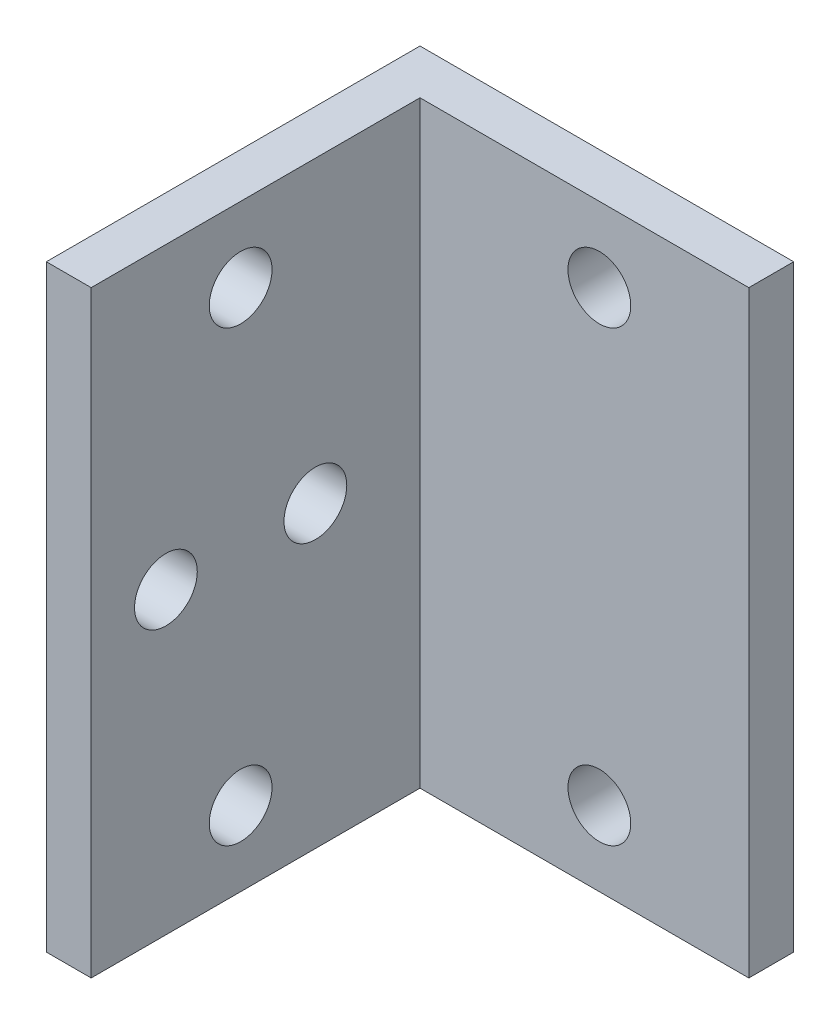
ISO-10303-21;
HEADER;
FILE_DESCRIPTION(('STEP AP214'),'2;1');
FILE_NAME('part.step','',(''),(''),'','','');
FILE_SCHEMA(('AUTOMOTIVE_DESIGN { 1 0 10303 214 1 1 1 1 }'));
ENDSEC;
DATA;
#1=APPLICATION_CONTEXT('core data for automotive mechanical design processes');
#2=APPLICATION_PROTOCOL_DEFINITION('international standard','automotive_design',2000,#1);
#3=PRODUCT_CONTEXT('',#1,'mechanical');
#4=PRODUCT('Part','Part','',(#3));
#5=PRODUCT_RELATED_PRODUCT_CATEGORY('part','',(#4));
#6=PRODUCT_DEFINITION_FORMATION('','',#4);
#7=PRODUCT_DEFINITION_CONTEXT('part definition',#1,'design');
#8=PRODUCT_DEFINITION('design','',#6,#7);
#9=PRODUCT_DEFINITION_SHAPE('','',#8);
#10=(LENGTH_UNIT() NAMED_UNIT(*) SI_UNIT(.MILLI.,.METRE.));
#11=(NAMED_UNIT(*) PLANE_ANGLE_UNIT() SI_UNIT($,.RADIAN.));
#12=(NAMED_UNIT(*) SI_UNIT($,.STERADIAN.) SOLID_ANGLE_UNIT());
#13=UNCERTAINTY_MEASURE_WITH_UNIT(LENGTH_MEASURE(1.E-05),#10,'distance_accuracy_value','');
#14=(GEOMETRIC_REPRESENTATION_CONTEXT(3) GLOBAL_UNCERTAINTY_ASSIGNED_CONTEXT((#13)) GLOBAL_UNIT_ASSIGNED_CONTEXT((#10,
#11,#12)) REPRESENTATION_CONTEXT('',''));
#15=CARTESIAN_POINT('',(0.,0.,0.));
#16=DIRECTION('',(0.,0.,1.));
#17=DIRECTION('',(1.,0.,0.));
#18=AXIS2_PLACEMENT_3D('',#15,#16,#17);
#19=CARTESIAN_POINT('',(58.,220.,-4.99999999999998));
#20=DIRECTION('',(0.,1.,0.));
#21=DIRECTION('',(0.,0.,1.));
#22=AXIS2_PLACEMENT_3D('',#19,#20,#21);
#23=PLANE('',#22);
#24=DIRECTION('',(-1.,0.,0.));
#25=VECTOR('',#24,1.);
#26=CARTESIAN_POINT('',(58.,220.,-1.99999999999999));
#27=LINE('',#26,#25);
#28=CARTESIAN_POINT('',(58.,220.,-1.99999999999999));
#29=VERTEX_POINT('',#28);
#30=CARTESIAN_POINT('',(36.,220.,-1.99999999999999));
#31=VERTEX_POINT('',#30);
#32=EDGE_CURVE('E99',#29,#31,#27,.T.);
#33=ORIENTED_EDGE('',*,*,#32,.F.);
#34=DIRECTION('',(0.,0.,1.));
#35=VECTOR('',#34,1.);
#36=CARTESIAN_POINT('',(58.,220.,-4.99999999999998));
#37=LINE('',#36,#35);
#38=CARTESIAN_POINT('',(58.,220.,-4.99999999999998));
#39=VERTEX_POINT('',#38);
#40=EDGE_CURVE('E11',#39,#29,#37,.T.);
#41=ORIENTED_EDGE('',*,*,#40,.F.);
#42=DIRECTION('',(-1.,0.,0.));
#43=VECTOR('',#42,1.);
#44=CARTESIAN_POINT('',(58.,220.,-4.99999999999998));
#45=LINE('',#44,#43);
#46=CARTESIAN_POINT('',(33.,220.,-4.99999999999998));
#47=VERTEX_POINT('',#46);
#48=EDGE_CURVE('E122',#39,#47,#45,.T.);
#49=ORIENTED_EDGE('',*,*,#48,.T.);
#50=DIRECTION('',(0.,0.,1.));
#51=VECTOR('',#50,1.);
#52=CARTESIAN_POINT('',(33.,220.,-4.99999999999998));
#53=LINE('',#52,#51);
#54=CARTESIAN_POINT('',(33.,220.,20.));
#55=VERTEX_POINT('',#54);
#56=EDGE_CURVE('E77',#47,#55,#53,.T.);
#57=ORIENTED_EDGE('',*,*,#56,.T.);
#58=DIRECTION('',(-1.,0.,0.));
#59=VECTOR('',#58,1.);
#60=CARTESIAN_POINT('',(58.,220.,20.));
#61=LINE('',#60,#59);
#62=CARTESIAN_POINT('',(36.,220.,20.));
#63=VERTEX_POINT('',#62);
#64=EDGE_CURVE('E120',#63,#55,#61,.T.);
#65=ORIENTED_EDGE('',*,*,#64,.F.);
#66=DIRECTION('',(0.,0.,1.));
#67=VECTOR('',#66,1.);
#68=CARTESIAN_POINT('',(36.,220.,-1.99999999999999));
#69=LINE('',#68,#67);
#70=EDGE_CURVE('E48',#31,#63,#69,.T.);
#71=ORIENTED_EDGE('',*,*,#70,.F.);
#72=EDGE_LOOP('',(#33,#41,#49,#57,#65,#71));
#73=FACE_BOUND('',#72,.T.);
#74=ADVANCED_FACE('F32',(#73),#23,.T.);
#75=CARTESIAN_POINT('',(58.,180.,-4.99999999999998));
#76=DIRECTION('',(1.,0.,0.));
#77=DIRECTION('',(0.,0.,-1.));
#78=AXIS2_PLACEMENT_3D('',#75,#76,#77);
#79=PLANE('',#78);
#80=DIRECTION('',(0.,1.,0.));
#81=VECTOR('',#80,1.);
#82=CARTESIAN_POINT('',(58.,180.,-1.99999999999999));
#83=LINE('',#82,#81);
#84=CARTESIAN_POINT('',(58.,180.,-1.99999999999999));
#85=VERTEX_POINT('',#84);
#86=EDGE_CURVE('E118',#85,#29,#83,.T.);
#87=ORIENTED_EDGE('',*,*,#86,.F.);
#88=DIRECTION('',(0.,0.,1.));
#89=VECTOR('',#88,1.);
#90=CARTESIAN_POINT('',(58.,180.,-4.99999999999998));
#91=LINE('',#90,#89);
#92=CARTESIAN_POINT('',(58.,180.,-4.99999999999998));
#93=VERTEX_POINT('',#92);
#94=EDGE_CURVE('E40',#93,#85,#91,.T.);
#95=ORIENTED_EDGE('',*,*,#94,.F.);
#96=DIRECTION('',(0.,1.,0.));
#97=VECTOR('',#96,1.);
#98=CARTESIAN_POINT('',(58.,180.,-4.99999999999998));
#99=LINE('',#98,#97);
#100=EDGE_CURVE('E129',#93,#39,#99,.T.);
#101=ORIENTED_EDGE('',*,*,#100,.T.);
#102=ORIENTED_EDGE('',*,*,#40,.T.);
#103=EDGE_LOOP('',(#87,#95,#101,#102));
#104=FACE_BOUND('',#103,.T.);
#105=ADVANCED_FACE('F147',(#104),#79,.T.);
#106=CARTESIAN_POINT('',(33.,180.,-4.99999999999998));
#107=DIRECTION('',(0.,-1.,0.));
#108=DIRECTION('',(0.,0.,-1.));
#109=AXIS2_PLACEMENT_3D('',#106,#107,#108);
#110=PLANE('',#109);
#111=DIRECTION('',(-1.,0.,0.));
#112=VECTOR('',#111,1.);
#113=CARTESIAN_POINT('',(58.,180.,-1.99999999999999));
#114=LINE('',#113,#112);
#115=CARTESIAN_POINT('',(36.,180.,-1.99999999999999));
#116=VERTEX_POINT('',#115);
#117=EDGE_CURVE('E97',#85,#116,#114,.T.);
#118=ORIENTED_EDGE('',*,*,#117,.T.);
#119=DIRECTION('',(0.,0.,1.));
#120=VECTOR('',#119,1.);
#121=CARTESIAN_POINT('',(36.,180.,-1.99999999999999));
#122=LINE('',#121,#120);
#123=CARTESIAN_POINT('',(36.,180.,20.));
#124=VERTEX_POINT('',#123);
#125=EDGE_CURVE('E101',#116,#124,#122,.T.);
#126=ORIENTED_EDGE('',*,*,#125,.T.);
#127=DIRECTION('',(1.,0.,0.));
#128=VECTOR('',#127,1.);
#129=CARTESIAN_POINT('',(33.,180.,20.));
#130=LINE('',#129,#128);
#131=CARTESIAN_POINT('',(33.,180.,20.));
#132=VERTEX_POINT('',#131);
#133=EDGE_CURVE('E125',#132,#124,#130,.T.);
#134=ORIENTED_EDGE('',*,*,#133,.F.);
#135=DIRECTION('',(0.,0.,1.));
#136=VECTOR('',#135,1.);
#137=CARTESIAN_POINT('',(33.,180.,-4.99999999999998));
#138=LINE('',#137,#136);
#139=CARTESIAN_POINT('',(33.,180.,-4.99999999999998));
#140=VERTEX_POINT('',#139);
#141=EDGE_CURVE('E72',#140,#132,#138,.T.);
#142=ORIENTED_EDGE('',*,*,#141,.F.);
#143=DIRECTION('',(1.,0.,0.));
#144=VECTOR('',#143,1.);
#145=CARTESIAN_POINT('',(33.,180.,-4.99999999999998));
#146=LINE('',#145,#144);
#147=EDGE_CURVE('E127',#140,#93,#146,.T.);
#148=ORIENTED_EDGE('',*,*,#147,.T.);
#149=ORIENTED_EDGE('',*,*,#94,.T.);
#150=EDGE_LOOP('',(#118,#126,#134,#142,#148,#149));
#151=FACE_BOUND('',#150,.T.);
#152=ADVANCED_FACE('F109',(#151),#110,.T.);
#153=CARTESIAN_POINT('',(33.,220.,-4.99999999999998));
#154=DIRECTION('',(-1.,0.,0.));
#155=DIRECTION('',(0.,0.,1.));
#156=AXIS2_PLACEMENT_3D('',#153,#154,#155);
#157=PLANE('',#156);
#158=CARTESIAN_POINT('',(33.,185.,10.));
#159=DIRECTION('',(1.,0.,0.));
#160=DIRECTION('',(0.,0.,-1.));
#161=AXIS2_PLACEMENT_3D('',#158,#159,#160);
#162=CIRCLE('',#161,2.09999999999999);
#163=CARTESIAN_POINT('',(33.,185.,7.90000000000001));
#164=VERTEX_POINT('',#163);
#165=EDGE_CURVE('E166',#164,#164,#162,.T.);
#166=ORIENTED_EDGE('',*,*,#165,.T.);
#167=EDGE_LOOP('',(#166));
#168=FACE_BOUND('',#167,.T.);
#169=CARTESIAN_POINT('',(33.,215.,10.));
#170=DIRECTION('',(1.,0.,0.));
#171=DIRECTION('',(0.,0.,-1.));
#172=AXIS2_PLACEMENT_3D('',#169,#170,#171);
#173=CIRCLE('',#172,2.09999999999999);
#174=CARTESIAN_POINT('',(33.,215.,7.90000000000001));
#175=VERTEX_POINT('',#174);
#176=EDGE_CURVE('E170',#175,#175,#173,.T.);
#177=ORIENTED_EDGE('',*,*,#176,.T.);
#178=EDGE_LOOP('',(#177));
#179=FACE_BOUND('',#178,.T.);
#180=CARTESIAN_POINT('',(33.,200.,5.00000000000001));
#181=DIRECTION('',(1.,0.,0.));
#182=DIRECTION('',(0.,0.,-1.));
#183=AXIS2_PLACEMENT_3D('',#180,#181,#182);
#184=CIRCLE('',#183,2.09999999999999);
#185=CARTESIAN_POINT('',(33.,200.,2.90000000000002));
#186=VERTEX_POINT('',#185);
#187=EDGE_CURVE('E174',#186,#186,#184,.T.);
#188=ORIENTED_EDGE('',*,*,#187,.T.);
#189=EDGE_LOOP('',(#188));
#190=FACE_BOUND('',#189,.T.);
#191=CARTESIAN_POINT('',(33.,200.,15.));
#192=DIRECTION('',(1.,0.,0.));
#193=DIRECTION('',(0.,0.,-1.));
#194=AXIS2_PLACEMENT_3D('',#191,#192,#193);
#195=CIRCLE('',#194,2.09999999999999);
#196=CARTESIAN_POINT('',(33.,200.,12.9));
#197=VERTEX_POINT('',#196);
#198=EDGE_CURVE('E177',#197,#197,#195,.T.);
#199=ORIENTED_EDGE('',*,*,#198,.T.);
#200=EDGE_LOOP('',(#199));
#201=FACE_BOUND('',#200,.T.);
#202=DIRECTION('',(0.,-1.,0.));
#203=VECTOR('',#202,1.);
#204=CARTESIAN_POINT('',(33.,220.,20.));
#205=LINE('',#204,#203);
#206=EDGE_CURVE('E133',#55,#132,#205,.T.);
#207=ORIENTED_EDGE('',*,*,#206,.F.);
#208=ORIENTED_EDGE('',*,*,#56,.F.);
#209=DIRECTION('',(0.,-1.,0.));
#210=VECTOR('',#209,1.);
#211=CARTESIAN_POINT('',(33.,220.,-4.99999999999998));
#212=LINE('',#211,#210);
#213=EDGE_CURVE('E124',#47,#140,#212,.T.);
#214=ORIENTED_EDGE('',*,*,#213,.T.);
#215=ORIENTED_EDGE('',*,*,#141,.T.);
#216=EDGE_LOOP('',(#207,#208,#214,#215));
#217=FACE_BOUND('',#216,.T.);
#218=ADVANCED_FACE('F139',(#168,#179,#190,#201,#217),#157,.T.);
#219=CARTESIAN_POINT('',(0.,0.,-4.99999999999998));
#220=DIRECTION('',(0.,0.,1.));
#221=DIRECTION('',(1.,0.,0.));
#222=AXIS2_PLACEMENT_3D('',#219,#220,#221);
#223=PLANE('',#222);
#224=CARTESIAN_POINT('',(48.,185.,-4.99999999999998));
#225=DIRECTION('',(0.,0.,-1.));
#226=DIRECTION('',(-1.,0.,0.));
#227=AXIS2_PLACEMENT_3D('',#224,#225,#226);
#228=CIRCLE('',#227,2.09999999999998);
#229=CARTESIAN_POINT('',(45.9,185.,-4.99999999999998));
#230=VERTEX_POINT('',#229);
#231=EDGE_CURVE('E179',#230,#230,#228,.T.);
#232=ORIENTED_EDGE('',*,*,#231,.F.);
#233=EDGE_LOOP('',(#232));
#234=FACE_BOUND('',#233,.T.);
#235=CARTESIAN_POINT('',(48.,215.,-4.99999999999998));
#236=DIRECTION('',(0.,0.,-1.));
#237=DIRECTION('',(-1.,0.,0.));
#238=AXIS2_PLACEMENT_3D('',#235,#236,#237);
#239=CIRCLE('',#238,2.09999999999998);
#240=CARTESIAN_POINT('',(45.9,215.,-4.99999999999998));
#241=VERTEX_POINT('',#240);
#242=EDGE_CURVE('E187',#241,#241,#239,.T.);
#243=ORIENTED_EDGE('',*,*,#242,.F.);
#244=EDGE_LOOP('',(#243));
#245=FACE_BOUND('',#244,.T.);
#246=ORIENTED_EDGE('',*,*,#48,.F.);
#247=ORIENTED_EDGE('',*,*,#100,.F.);
#248=ORIENTED_EDGE('',*,*,#147,.F.);
#249=ORIENTED_EDGE('',*,*,#213,.F.);
#250=EDGE_LOOP('',(#246,#247,#248,#249));
#251=FACE_BOUND('',#250,.T.);
#252=ADVANCED_FACE('F145',(#234,#245,#251),#223,.F.);
#253=CARTESIAN_POINT('',(0.,0.,20.));
#254=DIRECTION('',(0.,0.,1.));
#255=DIRECTION('',(1.,0.,0.));
#256=AXIS2_PLACEMENT_3D('',#253,#254,#255);
#257=PLANE('',#256);
#258=DIRECTION('',(0.,1.,0.));
#259=VECTOR('',#258,1.);
#260=CARTESIAN_POINT('',(36.,180.,20.));
#261=LINE('',#260,#259);
#262=EDGE_CURVE('E100',#124,#63,#261,.T.);
#263=ORIENTED_EDGE('',*,*,#262,.T.);
#264=ORIENTED_EDGE('',*,*,#64,.T.);
#265=ORIENTED_EDGE('',*,*,#206,.T.);
#266=ORIENTED_EDGE('',*,*,#133,.T.);
#267=EDGE_LOOP('',(#263,#264,#265,#266));
#268=FACE_BOUND('',#267,.T.);
#269=ADVANCED_FACE('F141',(#268),#257,.T.);
#270=CARTESIAN_POINT('',(58.,180.,-1.99999999999999));
#271=DIRECTION('',(0.,0.,-1.));
#272=DIRECTION('',(-1.,0.,0.));
#273=AXIS2_PLACEMENT_3D('',#270,#271,#272);
#274=PLANE('',#273);
#275=CARTESIAN_POINT('',(48.,185.,-1.99999999999999));
#276=DIRECTION('',(0.,0.,-1.));
#277=DIRECTION('',(-1.,0.,0.));
#278=AXIS2_PLACEMENT_3D('',#275,#276,#277);
#279=CIRCLE('',#278,2.09999999999998);
#280=CARTESIAN_POINT('',(45.9,185.,-1.99999999999999));
#281=VERTEX_POINT('',#280);
#282=EDGE_CURVE('E35',#281,#281,#279,.T.);
#283=ORIENTED_EDGE('',*,*,#282,.T.);
#284=EDGE_LOOP('',(#283));
#285=FACE_BOUND('',#284,.T.);
#286=CARTESIAN_POINT('',(48.,215.,-1.99999999999999));
#287=DIRECTION('',(0.,0.,-1.));
#288=DIRECTION('',(-1.,0.,0.));
#289=AXIS2_PLACEMENT_3D('',#286,#287,#288);
#290=CIRCLE('',#289,2.09999999999998);
#291=CARTESIAN_POINT('',(45.9,215.,-1.99999999999999));
#292=VERTEX_POINT('',#291);
#293=EDGE_CURVE('E114',#292,#292,#290,.T.);
#294=ORIENTED_EDGE('',*,*,#293,.T.);
#295=EDGE_LOOP('',(#294));
#296=FACE_BOUND('',#295,.T.);
#297=ORIENTED_EDGE('',*,*,#32,.T.);
#298=DIRECTION('',(0.,1.,0.));
#299=VECTOR('',#298,1.);
#300=CARTESIAN_POINT('',(36.,180.,-1.99999999999999));
#301=LINE('',#300,#299);
#302=EDGE_CURVE('E93',#116,#31,#301,.T.);
#303=ORIENTED_EDGE('',*,*,#302,.F.);
#304=ORIENTED_EDGE('',*,*,#117,.F.);
#305=ORIENTED_EDGE('',*,*,#86,.T.);
#306=EDGE_LOOP('',(#297,#303,#304,#305));
#307=FACE_BOUND('',#306,.T.);
#308=ADVANCED_FACE('F95',(#285,#296,#307),#274,.F.);
#309=CARTESIAN_POINT('',(36.,180.,-1.99999999999999));
#310=DIRECTION('',(-1.,0.,0.));
#311=DIRECTION('',(0.,0.,1.));
#312=AXIS2_PLACEMENT_3D('',#309,#310,#311);
#313=PLANE('',#312);
#314=CARTESIAN_POINT('',(36.,185.,10.));
#315=DIRECTION('',(1.,0.,0.));
#316=DIRECTION('',(0.,0.,-1.));
#317=AXIS2_PLACEMENT_3D('',#314,#315,#316);
#318=CIRCLE('',#317,2.09999999999999);
#319=CARTESIAN_POINT('',(36.,185.,7.90000000000001));
#320=VERTEX_POINT('',#319);
#321=EDGE_CURVE('E292',#320,#320,#318,.T.);
#322=ORIENTED_EDGE('',*,*,#321,.F.);
#323=EDGE_LOOP('',(#322));
#324=FACE_BOUND('',#323,.T.);
#325=CARTESIAN_POINT('',(36.,215.,10.));
#326=DIRECTION('',(1.,0.,0.));
#327=DIRECTION('',(0.,0.,-1.));
#328=AXIS2_PLACEMENT_3D('',#325,#326,#327);
#329=CIRCLE('',#328,2.09999999999999);
#330=CARTESIAN_POINT('',(36.,215.,7.90000000000001));
#331=VERTEX_POINT('',#330);
#332=EDGE_CURVE('E294',#331,#331,#329,.T.);
#333=ORIENTED_EDGE('',*,*,#332,.F.);
#334=EDGE_LOOP('',(#333));
#335=FACE_BOUND('',#334,.T.);
#336=CARTESIAN_POINT('',(36.,200.,5.00000000000001));
#337=DIRECTION('',(1.,0.,0.));
#338=DIRECTION('',(0.,0.,-1.));
#339=AXIS2_PLACEMENT_3D('',#336,#337,#338);
#340=CIRCLE('',#339,2.09999999999999);
#341=CARTESIAN_POINT('',(36.,200.,2.90000000000002));
#342=VERTEX_POINT('',#341);
#343=EDGE_CURVE('E300',#342,#342,#340,.T.);
#344=ORIENTED_EDGE('',*,*,#343,.F.);
#345=EDGE_LOOP('',(#344));
#346=FACE_BOUND('',#345,.T.);
#347=CARTESIAN_POINT('',(36.,200.,15.));
#348=DIRECTION('',(1.,0.,0.));
#349=DIRECTION('',(0.,0.,-1.));
#350=AXIS2_PLACEMENT_3D('',#347,#348,#349);
#351=CIRCLE('',#350,2.09999999999999);
#352=CARTESIAN_POINT('',(36.,200.,12.9));
#353=VERTEX_POINT('',#352);
#354=EDGE_CURVE('E180',#353,#353,#351,.T.);
#355=ORIENTED_EDGE('',*,*,#354,.F.);
#356=EDGE_LOOP('',(#355));
#357=FACE_BOUND('',#356,.T.);
#358=ORIENTED_EDGE('',*,*,#70,.T.);
#359=ORIENTED_EDGE('',*,*,#262,.F.);
#360=ORIENTED_EDGE('',*,*,#125,.F.);
#361=ORIENTED_EDGE('',*,*,#302,.T.);
#362=EDGE_LOOP('',(#358,#359,#360,#361));
#363=FACE_BOUND('',#362,.T.);
#364=ADVANCED_FACE('F104',(#324,#335,#346,#357,#363),#313,.F.);
#365=CARTESIAN_POINT('',(48.,215.,-4.99999999999998));
#366=DIRECTION('',(0.,0.,-1.));
#367=DIRECTION('',(-1.,0.,0.));
#368=AXIS2_PLACEMENT_3D('',#365,#366,#367);
#369=CYLINDRICAL_SURFACE('',#368,2.09999999999998);
#370=ORIENTED_EDGE('',*,*,#242,.T.);
#371=EDGE_LOOP('',(#370));
#372=FACE_BOUND('',#371,.T.);
#373=ORIENTED_EDGE('',*,*,#293,.F.);
#374=EDGE_LOOP('',(#373));
#375=FACE_BOUND('',#374,.T.);
#376=ADVANCED_FACE('F200',(#372,#375),#369,.F.);
#377=CARTESIAN_POINT('',(48.,185.,-4.99999999999998));
#378=DIRECTION('',(0.,0.,-1.));
#379=DIRECTION('',(-1.,0.,0.));
#380=AXIS2_PLACEMENT_3D('',#377,#378,#379);
#381=CYLINDRICAL_SURFACE('',#380,2.09999999999998);
#382=ORIENTED_EDGE('',*,*,#231,.T.);
#383=EDGE_LOOP('',(#382));
#384=FACE_BOUND('',#383,.T.);
#385=ORIENTED_EDGE('',*,*,#282,.F.);
#386=EDGE_LOOP('',(#385));
#387=FACE_BOUND('',#386,.T.);
#388=ADVANCED_FACE('F197',(#384,#387),#381,.F.);
#389=CARTESIAN_POINT('',(36.,200.,15.));
#390=DIRECTION('',(1.,0.,0.));
#391=DIRECTION('',(0.,0.,-1.));
#392=AXIS2_PLACEMENT_3D('',#389,#390,#391);
#393=CYLINDRICAL_SURFACE('',#392,2.09999999999999);
#394=ORIENTED_EDGE('',*,*,#198,.F.);
#395=EDGE_LOOP('',(#394));
#396=FACE_BOUND('',#395,.T.);
#397=ORIENTED_EDGE('',*,*,#354,.T.);
#398=EDGE_LOOP('',(#397));
#399=FACE_BOUND('',#398,.T.);
#400=ADVANCED_FACE('F199',(#396,#399),#393,.F.);
#401=CARTESIAN_POINT('',(36.,200.,5.00000000000001));
#402=DIRECTION('',(1.,0.,0.));
#403=DIRECTION('',(0.,0.,-1.));
#404=AXIS2_PLACEMENT_3D('',#401,#402,#403);
#405=CYLINDRICAL_SURFACE('',#404,2.09999999999999);
#406=ORIENTED_EDGE('',*,*,#187,.F.);
#407=EDGE_LOOP('',(#406));
#408=FACE_BOUND('',#407,.T.);
#409=ORIENTED_EDGE('',*,*,#343,.T.);
#410=EDGE_LOOP('',(#409));
#411=FACE_BOUND('',#410,.T.);
#412=ADVANCED_FACE('F207',(#408,#411),#405,.F.);
#413=CARTESIAN_POINT('',(36.,215.,10.));
#414=DIRECTION('',(1.,0.,0.));
#415=DIRECTION('',(0.,0.,-1.));
#416=AXIS2_PLACEMENT_3D('',#413,#414,#415);
#417=CYLINDRICAL_SURFACE('',#416,2.09999999999999);
#418=ORIENTED_EDGE('',*,*,#176,.F.);
#419=EDGE_LOOP('',(#418));
#420=FACE_BOUND('',#419,.T.);
#421=ORIENTED_EDGE('',*,*,#332,.T.);
#422=EDGE_LOOP('',(#421));
#423=FACE_BOUND('',#422,.T.);
#424=ADVANCED_FACE('F266',(#420,#423),#417,.F.);
#425=CARTESIAN_POINT('',(36.,185.,10.));
#426=DIRECTION('',(1.,0.,0.));
#427=DIRECTION('',(0.,0.,-1.));
#428=AXIS2_PLACEMENT_3D('',#425,#426,#427);
#429=CYLINDRICAL_SURFACE('',#428,2.09999999999999);
#430=ORIENTED_EDGE('',*,*,#165,.F.);
#431=EDGE_LOOP('',(#430));
#432=FACE_BOUND('',#431,.T.);
#433=ORIENTED_EDGE('',*,*,#321,.T.);
#434=EDGE_LOOP('',(#433));
#435=FACE_BOUND('',#434,.T.);
#436=ADVANCED_FACE('F275',(#432,#435),#429,.F.);
#437=CLOSED_SHELL('',(#74,#105,#152,#218,#252,#269,#308,#364,#376,#388,#400,#412,#424,#436));
#438=MANIFOLD_SOLID_BREP('B2',#437);
#439=ADVANCED_BREP_SHAPE_REPRESENTATION('',(#18,#438),#14);
#440=SHAPE_DEFINITION_REPRESENTATION(#9,#439);
ENDSEC;
END-ISO-10303-21;
